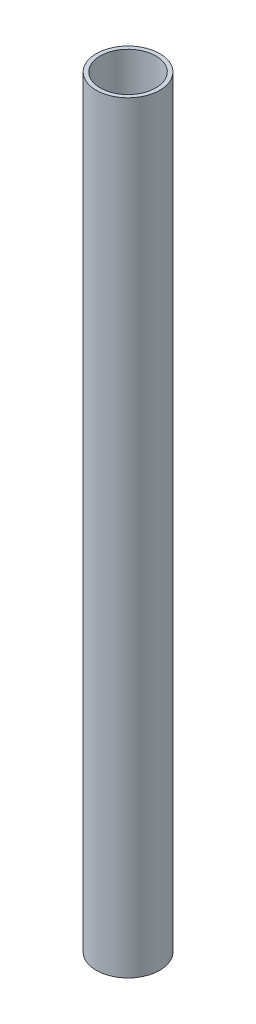
ISO-10303-21;
HEADER;
FILE_DESCRIPTION(('STEP AP214'),'2;1');
FILE_NAME('part.step','',(''),(''),'','','');
FILE_SCHEMA(('AUTOMOTIVE_DESIGN { 1 0 10303 214 1 1 1 1 }'));
ENDSEC;
DATA;
#1=APPLICATION_CONTEXT('core data for automotive mechanical design processes');
#2=APPLICATION_PROTOCOL_DEFINITION('international standard','automotive_design',2000,#1);
#3=PRODUCT_CONTEXT('',#1,'mechanical');
#4=PRODUCT('Part','Part','',(#3));
#5=PRODUCT_RELATED_PRODUCT_CATEGORY('part','',(#4));
#6=PRODUCT_DEFINITION_FORMATION('','',#4);
#7=PRODUCT_DEFINITION_CONTEXT('part definition',#1,'design');
#8=PRODUCT_DEFINITION('design','',#6,#7);
#9=PRODUCT_DEFINITION_SHAPE('','',#8);
#10=(LENGTH_UNIT() NAMED_UNIT(*) SI_UNIT(.MILLI.,.METRE.));
#11=(NAMED_UNIT(*) PLANE_ANGLE_UNIT() SI_UNIT($,.RADIAN.));
#12=(NAMED_UNIT(*) SI_UNIT($,.STERADIAN.) SOLID_ANGLE_UNIT());
#13=UNCERTAINTY_MEASURE_WITH_UNIT(LENGTH_MEASURE(1.E-05),#10,'distance_accuracy_value','');
#14=(GEOMETRIC_REPRESENTATION_CONTEXT(3) GLOBAL_UNCERTAINTY_ASSIGNED_CONTEXT((#13)) GLOBAL_UNIT_ASSIGNED_CONTEXT((#10,
#11,#12)) REPRESENTATION_CONTEXT('',''));
#15=CARTESIAN_POINT('',(0.,0.,0.));
#16=DIRECTION('',(0.,0.,1.));
#17=DIRECTION('',(1.,0.,0.));
#18=AXIS2_PLACEMENT_3D('',#15,#16,#17);
#19=CARTESIAN_POINT('',(0.,609.6,0.));
#20=DIRECTION('',(0.,1.,0.));
#21=DIRECTION('',(0.,0.,1.));
#22=AXIS2_PLACEMENT_3D('',#19,#20,#21);
#23=PLANE('',#22);
#24=CARTESIAN_POINT('',(0.,609.6,0.));
#25=DIRECTION('',(0.,1.,0.));
#26=DIRECTION('',(0.,0.,1.));
#27=AXIS2_PLACEMENT_3D('',#24,#25,#26);
#28=CIRCLE('',#27,25.4);
#29=CARTESIAN_POINT('',(0.,609.6,-25.4));
#30=VERTEX_POINT('',#29);
#31=EDGE_CURVE('E10',#30,#30,#28,.T.);
#32=ORIENTED_EDGE('',*,*,#31,.T.);
#33=EDGE_LOOP('',(#32));
#34=FACE_BOUND('',#33,.T.);
#35=CARTESIAN_POINT('',(0.,609.6,0.));
#36=DIRECTION('',(0.,1.,0.));
#37=DIRECTION('',(0.,0.,1.));
#38=AXIS2_PLACEMENT_3D('',#35,#36,#37);
#39=CIRCLE('',#38,22.225);
#40=CARTESIAN_POINT('',(0.,609.6,-22.225));
#41=VERTEX_POINT('',#40);
#42=EDGE_CURVE('E50',#41,#41,#39,.T.);
#43=ORIENTED_EDGE('',*,*,#42,.F.);
#44=EDGE_LOOP('',(#43));
#45=FACE_BOUND('',#44,.T.);
#46=ADVANCED_FACE('F37',(#34,#45),#23,.T.);
#47=CARTESIAN_POINT('',(0.,0.,0.));
#48=DIRECTION('',(0.,1.,0.));
#49=DIRECTION('',(0.,0.,1.));
#50=AXIS2_PLACEMENT_3D('',#47,#48,#49);
#51=PLANE('',#50);
#52=CARTESIAN_POINT('',(0.,0.,0.));
#53=DIRECTION('',(0.,1.,0.));
#54=DIRECTION('',(0.,0.,1.));
#55=AXIS2_PLACEMENT_3D('',#52,#53,#54);
#56=CIRCLE('',#55,25.4);
#57=CARTESIAN_POINT('',(0.,0.,-25.4));
#58=VERTEX_POINT('',#57);
#59=EDGE_CURVE('E41',#58,#58,#56,.T.);
#60=ORIENTED_EDGE('',*,*,#59,.F.);
#61=EDGE_LOOP('',(#60));
#62=FACE_BOUND('',#61,.T.);
#63=CARTESIAN_POINT('',(0.,0.,0.));
#64=DIRECTION('',(0.,1.,0.));
#65=DIRECTION('',(0.,0.,1.));
#66=AXIS2_PLACEMENT_3D('',#63,#64,#65);
#67=CIRCLE('',#66,22.225);
#68=CARTESIAN_POINT('',(0.,0.,-22.225));
#69=VERTEX_POINT('',#68);
#70=EDGE_CURVE('E52',#69,#69,#67,.T.);
#71=ORIENTED_EDGE('',*,*,#70,.T.);
#72=EDGE_LOOP('',(#71));
#73=FACE_BOUND('',#72,.T.);
#74=ADVANCED_FACE('F64',(#62,#73),#51,.F.);
#75=CARTESIAN_POINT('',(0.,609.6,0.));
#76=DIRECTION('',(0.,-1.,0.));
#77=DIRECTION('',(0.,0.,-1.));
#78=AXIS2_PLACEMENT_3D('',#75,#76,#77);
#79=CYLINDRICAL_SURFACE('',#78,25.4);
#80=CARTESIAN_POINT('',(0.,609.6,-25.4));
#81=CARTESIAN_POINT('',(0.,603.25,-25.4));
#82=CARTESIAN_POINT('',(0.,596.9,-25.4));
#83=CARTESIAN_POINT('',(0.,584.2,-25.4));
#84=CARTESIAN_POINT('',(0.,577.85,-25.4));
#85=CARTESIAN_POINT('',(0.,565.15,-25.4));
#86=CARTESIAN_POINT('',(0.,558.8,-25.4));
#87=CARTESIAN_POINT('',(0.,546.1,-25.4));
#88=CARTESIAN_POINT('',(0.,539.75,-25.4));
#89=CARTESIAN_POINT('',(0.,527.05,-25.4));
#90=CARTESIAN_POINT('',(0.,520.7,-25.4));
#91=CARTESIAN_POINT('',(0.,508.,-25.4));
#92=CARTESIAN_POINT('',(0.,501.65,-25.4));
#93=CARTESIAN_POINT('',(0.,488.95,-25.4));
#94=CARTESIAN_POINT('',(0.,482.6,-25.4));
#95=CARTESIAN_POINT('',(0.,469.9,-25.4));
#96=CARTESIAN_POINT('',(0.,463.55,-25.4));
#97=CARTESIAN_POINT('',(0.,450.85,-25.4));
#98=CARTESIAN_POINT('',(0.,444.5,-25.4));
#99=CARTESIAN_POINT('',(0.,431.8,-25.4));
#100=CARTESIAN_POINT('',(0.,425.45,-25.4));
#101=CARTESIAN_POINT('',(0.,412.75,-25.4));
#102=CARTESIAN_POINT('',(0.,406.4,-25.4));
#103=CARTESIAN_POINT('',(0.,393.7,-25.4));
#104=CARTESIAN_POINT('',(0.,387.35,-25.4));
#105=CARTESIAN_POINT('',(0.,374.65,-25.4));
#106=CARTESIAN_POINT('',(0.,368.3,-25.4));
#107=CARTESIAN_POINT('',(0.,355.6,-25.4));
#108=CARTESIAN_POINT('',(0.,349.25,-25.4));
#109=CARTESIAN_POINT('',(0.,336.55,-25.4));
#110=CARTESIAN_POINT('',(0.,330.2,-25.4));
#111=CARTESIAN_POINT('',(0.,317.5,-25.4));
#112=CARTESIAN_POINT('',(0.,311.15,-25.4));
#113=CARTESIAN_POINT('',(0.,298.45,-25.4));
#114=CARTESIAN_POINT('',(0.,292.1,-25.4));
#115=CARTESIAN_POINT('',(0.,279.4,-25.4));
#116=CARTESIAN_POINT('',(0.,273.05,-25.4));
#117=CARTESIAN_POINT('',(0.,260.35,-25.4));
#118=CARTESIAN_POINT('',(0.,254.,-25.4));
#119=CARTESIAN_POINT('',(0.,241.3,-25.4));
#120=CARTESIAN_POINT('',(0.,234.95,-25.4));
#121=CARTESIAN_POINT('',(0.,222.25,-25.4));
#122=CARTESIAN_POINT('',(0.,215.9,-25.4));
#123=CARTESIAN_POINT('',(0.,203.2,-25.4));
#124=CARTESIAN_POINT('',(0.,196.85,-25.4));
#125=CARTESIAN_POINT('',(0.,184.15,-25.4));
#126=CARTESIAN_POINT('',(0.,177.8,-25.4));
#127=CARTESIAN_POINT('',(0.,165.1,-25.4));
#128=CARTESIAN_POINT('',(0.,158.75,-25.4));
#129=CARTESIAN_POINT('',(0.,146.05,-25.4));
#130=CARTESIAN_POINT('',(0.,139.7,-25.4));
#131=CARTESIAN_POINT('',(0.,127.,-25.4));
#132=CARTESIAN_POINT('',(0.,120.65,-25.4));
#133=CARTESIAN_POINT('',(0.,107.95,-25.4));
#134=CARTESIAN_POINT('',(0.,101.6,-25.4));
#135=CARTESIAN_POINT('',(0.,88.9,-25.4));
#136=CARTESIAN_POINT('',(0.,82.5500000000001,-25.4));
#137=CARTESIAN_POINT('',(0.,69.85,-25.4));
#138=CARTESIAN_POINT('',(0.,63.5,-25.4));
#139=CARTESIAN_POINT('',(0.,50.8,-25.4));
#140=CARTESIAN_POINT('',(0.,44.45,-25.4));
#141=CARTESIAN_POINT('',(0.,31.75,-25.4));
#142=CARTESIAN_POINT('',(0.,25.4,-25.4));
#143=CARTESIAN_POINT('',(0.,12.7,-25.4));
#144=CARTESIAN_POINT('',(0.,6.35000000000001,-25.4));
#145=CARTESIAN_POINT('',(0.,0.,-25.4));
#146=B_SPLINE_CURVE_WITH_KNOTS('',3,(#80,#81,#82,#83,#84,#85,#86,#87,#88,#89,#90,#91,#92,#93,
#94,#95,#96,#97,#98,#99,#100,#101,#102,#103,#104,#105,#106,#107,#108,#109,#110,#111,#112,#113,
#114,#115,#116,#117,#118,#119,#120,#121,#122,#123,#124,#125,#126,#127,#128,#129,#130,#131,#132,
#133,#134,#135,#136,#137,#138,#139,#140,#141,#142,#143,#144,#145),.UNSPECIFIED.,.F.,.F.,(4,2,2,
2,2,2,2,2,2,2,2,2,2,2,2,2,2,2,2,2,2,2,2,2,2,2,2,2,2,2,2,2,4),(0.,19.05,38.1,57.15,76.2,
95.2500000000001,114.3,133.35,152.4,171.45,190.5,209.55,228.6,247.65,266.7,285.75,304.8,323.85,
342.9,361.95,381.,400.05,419.1,438.15,457.2,476.25,495.3,514.35,533.4,552.45,571.5,590.55,
609.6),.UNSPECIFIED.);
#147=EDGE_CURVE('BSEAM39',#30,#58,#146,.T.);
#148=ORIENTED_EDGE('',*,*,#31,.F.);
#149=ORIENTED_EDGE('',*,*,#59,.T.);
#150=ORIENTED_EDGE('',*,*,#147,.T.);
#151=ORIENTED_EDGE('',*,*,#147,.F.);
#152=EDGE_LOOP('',(#148,#150,#149,#151));
#153=FACE_BOUND('',#152,.T.);
#154=ADVANCED_FACE('F39',(#153),#79,.T.);
#155=CARTESIAN_POINT('',(0.,609.6,0.));
#156=DIRECTION('',(0.,-1.,0.));
#157=DIRECTION('',(0.,0.,-1.));
#158=AXIS2_PLACEMENT_3D('',#155,#156,#157);
#159=CYLINDRICAL_SURFACE('',#158,22.225);
#160=CARTESIAN_POINT('',(0.,609.6,-22.225));
#161=CARTESIAN_POINT('',(0.,603.25,-22.225));
#162=CARTESIAN_POINT('',(0.,596.9,-22.225));
#163=CARTESIAN_POINT('',(0.,584.2,-22.225));
#164=CARTESIAN_POINT('',(0.,577.85,-22.225));
#165=CARTESIAN_POINT('',(0.,565.15,-22.225));
#166=CARTESIAN_POINT('',(0.,558.8,-22.225));
#167=CARTESIAN_POINT('',(0.,546.1,-22.225));
#168=CARTESIAN_POINT('',(0.,539.75,-22.225));
#169=CARTESIAN_POINT('',(0.,527.05,-22.225));
#170=CARTESIAN_POINT('',(0.,520.7,-22.225));
#171=CARTESIAN_POINT('',(0.,508.,-22.225));
#172=CARTESIAN_POINT('',(0.,501.65,-22.225));
#173=CARTESIAN_POINT('',(0.,488.95,-22.225));
#174=CARTESIAN_POINT('',(0.,482.6,-22.225));
#175=CARTESIAN_POINT('',(0.,469.9,-22.225));
#176=CARTESIAN_POINT('',(0.,463.55,-22.225));
#177=CARTESIAN_POINT('',(0.,450.85,-22.225));
#178=CARTESIAN_POINT('',(0.,444.5,-22.225));
#179=CARTESIAN_POINT('',(0.,431.8,-22.225));
#180=CARTESIAN_POINT('',(0.,425.45,-22.225));
#181=CARTESIAN_POINT('',(0.,412.75,-22.225));
#182=CARTESIAN_POINT('',(0.,406.4,-22.225));
#183=CARTESIAN_POINT('',(0.,393.7,-22.225));
#184=CARTESIAN_POINT('',(0.,387.35,-22.225));
#185=CARTESIAN_POINT('',(0.,374.65,-22.225));
#186=CARTESIAN_POINT('',(0.,368.3,-22.225));
#187=CARTESIAN_POINT('',(0.,355.6,-22.225));
#188=CARTESIAN_POINT('',(0.,349.25,-22.225));
#189=CARTESIAN_POINT('',(0.,336.55,-22.225));
#190=CARTESIAN_POINT('',(0.,330.2,-22.225));
#191=CARTESIAN_POINT('',(0.,317.5,-22.225));
#192=CARTESIAN_POINT('',(0.,311.15,-22.225));
#193=CARTESIAN_POINT('',(0.,298.45,-22.225));
#194=CARTESIAN_POINT('',(0.,292.1,-22.225));
#195=CARTESIAN_POINT('',(0.,279.4,-22.225));
#196=CARTESIAN_POINT('',(0.,273.05,-22.225));
#197=CARTESIAN_POINT('',(0.,260.35,-22.225));
#198=CARTESIAN_POINT('',(0.,254.,-22.225));
#199=CARTESIAN_POINT('',(0.,241.3,-22.225));
#200=CARTESIAN_POINT('',(0.,234.95,-22.225));
#201=CARTESIAN_POINT('',(0.,222.25,-22.225));
#202=CARTESIAN_POINT('',(0.,215.9,-22.225));
#203=CARTESIAN_POINT('',(0.,203.2,-22.225));
#204=CARTESIAN_POINT('',(0.,196.85,-22.225));
#205=CARTESIAN_POINT('',(0.,184.15,-22.225));
#206=CARTESIAN_POINT('',(0.,177.8,-22.225));
#207=CARTESIAN_POINT('',(0.,165.1,-22.225));
#208=CARTESIAN_POINT('',(0.,158.75,-22.225));
#209=CARTESIAN_POINT('',(0.,146.05,-22.225));
#210=CARTESIAN_POINT('',(0.,139.7,-22.225));
#211=CARTESIAN_POINT('',(0.,127.,-22.225));
#212=CARTESIAN_POINT('',(0.,120.65,-22.225));
#213=CARTESIAN_POINT('',(0.,107.95,-22.225));
#214=CARTESIAN_POINT('',(0.,101.6,-22.225));
#215=CARTESIAN_POINT('',(0.,88.9,-22.225));
#216=CARTESIAN_POINT('',(0.,82.5500000000001,-22.225));
#217=CARTESIAN_POINT('',(0.,69.85,-22.225));
#218=CARTESIAN_POINT('',(0.,63.5,-22.225));
#219=CARTESIAN_POINT('',(0.,50.8,-22.225));
#220=CARTESIAN_POINT('',(0.,44.45,-22.225));
#221=CARTESIAN_POINT('',(0.,31.75,-22.225));
#222=CARTESIAN_POINT('',(0.,25.4,-22.225));
#223=CARTESIAN_POINT('',(0.,12.7,-22.225));
#224=CARTESIAN_POINT('',(0.,6.35000000000001,-22.225));
#225=CARTESIAN_POINT('',(0.,0.,-22.225));
#226=B_SPLINE_CURVE_WITH_KNOTS('',3,(#160,#161,#162,#163,#164,#165,#166,#167,#168,#169,#170,
#171,#172,#173,#174,#175,#176,#177,#178,#179,#180,#181,#182,#183,#184,#185,#186,#187,#188,#189,
#190,#191,#192,#193,#194,#195,#196,#197,#198,#199,#200,#201,#202,#203,#204,#205,#206,#207,#208,
#209,#210,#211,#212,#213,#214,#215,#216,#217,#218,#219,#220,#221,#222,#223,#224,#225),
.UNSPECIFIED.,.F.,.F.,(4,2,2,2,2,2,2,2,2,2,2,2,2,2,2,2,2,2,2,2,2,2,2,2,2,2,2,2,2,2,2,2,4),(0.,
19.0499999999999,38.0999999999999,57.1499999999999,76.1999999999999,95.2499999999999,114.3,
133.35,152.4,171.45,190.5,209.55,228.6,247.65,266.7,285.75,304.8,323.85,342.9,361.95,381.,
400.05,419.1,438.15,457.2,476.25,495.3,514.35,533.4,552.45,571.5,590.55,609.6),.UNSPECIFIED.);
#227=EDGE_CURVE('BSEAM60',#41,#69,#226,.T.);
#228=ORIENTED_EDGE('',*,*,#42,.T.);
#229=ORIENTED_EDGE('',*,*,#70,.F.);
#230=ORIENTED_EDGE('',*,*,#227,.T.);
#231=ORIENTED_EDGE('',*,*,#227,.F.);
#232=EDGE_LOOP('',(#228,#230,#229,#231));
#233=FACE_BOUND('',#232,.T.);
#234=ADVANCED_FACE('F60',(#233),#159,.F.);
#235=CLOSED_SHELL('',(#46,#74,#154,#234));
#236=MANIFOLD_SOLID_BREP('B2',#235);
#237=ADVANCED_BREP_SHAPE_REPRESENTATION('',(#18,#236),#14);
#238=SHAPE_DEFINITION_REPRESENTATION(#9,#237);
ENDSEC;
END-ISO-10303-21;
